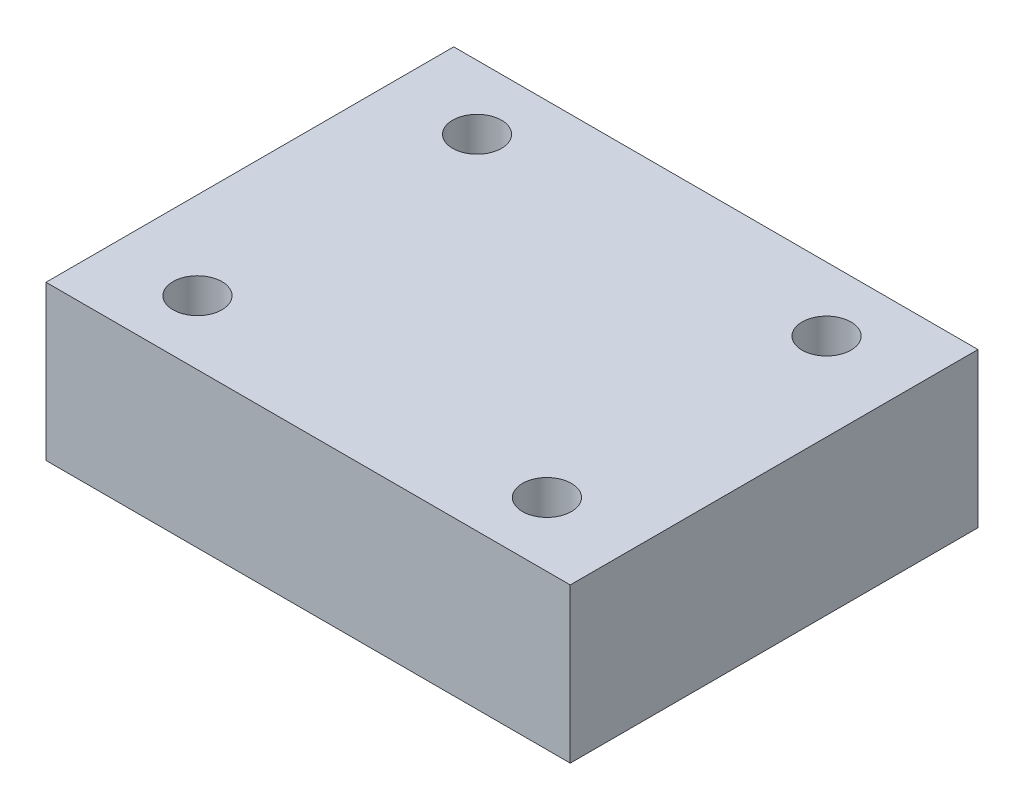
ISO-10303-21;
HEADER;
FILE_DESCRIPTION(('STEP AP214'),'2;1');
FILE_NAME('part.step','',(''),(''),'','','');
FILE_SCHEMA(('AUTOMOTIVE_DESIGN { 1 0 10303 214 1 1 1 1 }'));
ENDSEC;
DATA;
#1=APPLICATION_CONTEXT('core data for automotive mechanical design processes');
#2=APPLICATION_PROTOCOL_DEFINITION('international standard','automotive_design',2000,#1);
#3=PRODUCT_CONTEXT('',#1,'mechanical');
#4=PRODUCT('Part','Part','',(#3));
#5=PRODUCT_RELATED_PRODUCT_CATEGORY('part','',(#4));
#6=PRODUCT_DEFINITION_FORMATION('','',#4);
#7=PRODUCT_DEFINITION_CONTEXT('part definition',#1,'design');
#8=PRODUCT_DEFINITION('design','',#6,#7);
#9=PRODUCT_DEFINITION_SHAPE('','',#8);
#10=(LENGTH_UNIT() NAMED_UNIT(*) SI_UNIT(.MILLI.,.METRE.));
#11=(NAMED_UNIT(*) PLANE_ANGLE_UNIT() SI_UNIT($,.RADIAN.));
#12=(NAMED_UNIT(*) SI_UNIT($,.STERADIAN.) SOLID_ANGLE_UNIT());
#13=UNCERTAINTY_MEASURE_WITH_UNIT(LENGTH_MEASURE(1.E-05),#10,'distance_accuracy_value','');
#14=(GEOMETRIC_REPRESENTATION_CONTEXT(3) GLOBAL_UNCERTAINTY_ASSIGNED_CONTEXT((#13)) GLOBAL_UNIT_ASSIGNED_CONTEXT((#10,
#11,#12)) REPRESENTATION_CONTEXT('',''));
#15=CARTESIAN_POINT('',(0.,0.,0.));
#16=DIRECTION('',(0.,0.,1.));
#17=DIRECTION('',(1.,0.,0.));
#18=AXIS2_PLACEMENT_3D('',#15,#16,#17);
#19=CARTESIAN_POINT('',(0.,13.25,0.));
#20=DIRECTION('',(0.,-1.,0.));
#21=DIRECTION('',(0.,0.,-1.));
#22=AXIS2_PLACEMENT_3D('',#19,#20,#21);
#23=PLANE('',#22);
#24=DIRECTION('',(0.,0.,-1.));
#25=VECTOR('',#24,1.);
#26=CARTESIAN_POINT('',(22.5,13.25,17.5));
#27=LINE('',#26,#25);
#28=CARTESIAN_POINT('',(22.5,13.25,17.5));
#29=VERTEX_POINT('',#28);
#30=CARTESIAN_POINT('',(22.5,13.25,-17.5));
#31=VERTEX_POINT('',#30);
#32=EDGE_CURVE('E91',#29,#31,#27,.T.);
#33=ORIENTED_EDGE('',*,*,#32,.T.);
#34=DIRECTION('',(-1.,0.,0.));
#35=VECTOR('',#34,1.);
#36=CARTESIAN_POINT('',(-22.5,13.25,-17.5));
#37=LINE('',#36,#35);
#38=CARTESIAN_POINT('',(-22.5,13.25,-17.5));
#39=VERTEX_POINT('',#38);
#40=EDGE_CURVE('E86',#31,#39,#37,.T.);
#41=ORIENTED_EDGE('',*,*,#40,.T.);
#42=DIRECTION('',(0.,0.,1.));
#43=VECTOR('',#42,1.);
#44=CARTESIAN_POINT('',(-22.5,13.25,17.5));
#45=LINE('',#44,#43);
#46=CARTESIAN_POINT('',(-22.5,13.25,17.5));
#47=VERTEX_POINT('',#46);
#48=EDGE_CURVE('E89',#39,#47,#45,.T.);
#49=ORIENTED_EDGE('',*,*,#48,.T.);
#50=DIRECTION('',(1.,0.,0.));
#51=VECTOR('',#50,1.);
#52=CARTESIAN_POINT('',(-22.5,13.25,17.5));
#53=LINE('',#52,#51);
#54=EDGE_CURVE('E56',#47,#29,#53,.T.);
#55=ORIENTED_EDGE('',*,*,#54,.T.);
#56=EDGE_LOOP('',(#33,#41,#49,#55));
#57=FACE_BOUND('',#56,.T.);
#58=CARTESIAN_POINT('',(-15.,13.25,-12.));
#59=DIRECTION('',(0.,1.,0.));
#60=DIRECTION('',(0.,0.,1.));
#61=AXIS2_PLACEMENT_3D('',#58,#59,#60);
#62=CIRCLE('',#61,2.1);
#63=CARTESIAN_POINT('',(-15.,13.25,-9.9));
#64=VERTEX_POINT('',#63);
#65=EDGE_CURVE('E106',#64,#64,#62,.T.);
#66=ORIENTED_EDGE('',*,*,#65,.F.);
#67=EDGE_LOOP('',(#66));
#68=FACE_BOUND('',#67,.T.);
#69=CARTESIAN_POINT('',(15.,13.25,-12.));
#70=DIRECTION('',(0.,1.,0.));
#71=DIRECTION('',(0.,0.,1.));
#72=AXIS2_PLACEMENT_3D('',#69,#70,#71);
#73=CIRCLE('',#72,2.1);
#74=CARTESIAN_POINT('',(15.,13.25,-9.9));
#75=VERTEX_POINT('',#74);
#76=EDGE_CURVE('E121',#75,#75,#73,.T.);
#77=ORIENTED_EDGE('',*,*,#76,.F.);
#78=EDGE_LOOP('',(#77));
#79=FACE_BOUND('',#78,.T.);
#80=CARTESIAN_POINT('',(15.0000000000002,13.25,12.));
#81=DIRECTION('',(0.,1.,0.));
#82=DIRECTION('',(0.,0.,1.));
#83=AXIS2_PLACEMENT_3D('',#80,#81,#82);
#84=CIRCLE('',#83,2.1);
#85=CARTESIAN_POINT('',(15.0000000000002,13.25,14.1));
#86=VERTEX_POINT('',#85);
#87=EDGE_CURVE('E127',#86,#86,#84,.T.);
#88=ORIENTED_EDGE('',*,*,#87,.F.);
#89=EDGE_LOOP('',(#88));
#90=FACE_BOUND('',#89,.T.);
#91=CARTESIAN_POINT('',(-14.9999999999998,13.25,12.));
#92=DIRECTION('',(0.,1.,0.));
#93=DIRECTION('',(0.,0.,1.));
#94=AXIS2_PLACEMENT_3D('',#91,#92,#93);
#95=CIRCLE('',#94,2.1);
#96=CARTESIAN_POINT('',(-14.9999999999998,13.25,14.1));
#97=VERTEX_POINT('',#96);
#98=EDGE_CURVE('E133',#97,#97,#95,.T.);
#99=ORIENTED_EDGE('',*,*,#98,.F.);
#100=EDGE_LOOP('',(#99));
#101=FACE_BOUND('',#100,.T.);
#102=ADVANCED_FACE('F39',(#57,#68,#79,#90,#101),#23,.F.);
#103=CARTESIAN_POINT('',(0.,0.,0.));
#104=DIRECTION('',(0.,-1.,0.));
#105=DIRECTION('',(0.,0.,-1.));
#106=AXIS2_PLACEMENT_3D('',#103,#104,#105);
#107=PLANE('',#106);
#108=CARTESIAN_POINT('',(15.0000000000002,0.,12.));
#109=DIRECTION('',(0.,1.,0.));
#110=DIRECTION('',(0.,0.,1.));
#111=AXIS2_PLACEMENT_3D('',#108,#109,#110);
#112=CIRCLE('',#111,2.1);
#113=CARTESIAN_POINT('',(15.0000000000002,0.,14.1));
#114=VERTEX_POINT('',#113);
#115=EDGE_CURVE('E130',#114,#114,#112,.T.);
#116=ORIENTED_EDGE('',*,*,#115,.T.);
#117=EDGE_LOOP('',(#116));
#118=FACE_BOUND('',#117,.T.);
#119=CARTESIAN_POINT('',(-15.,0.,-12.));
#120=DIRECTION('',(0.,1.,0.));
#121=DIRECTION('',(0.,0.,1.));
#122=AXIS2_PLACEMENT_3D('',#119,#120,#121);
#123=CIRCLE('',#122,2.1);
#124=CARTESIAN_POINT('',(-15.,0.,-9.9));
#125=VERTEX_POINT('',#124);
#126=EDGE_CURVE('E118',#125,#125,#123,.T.);
#127=ORIENTED_EDGE('',*,*,#126,.T.);
#128=EDGE_LOOP('',(#127));
#129=FACE_BOUND('',#128,.T.);
#130=DIRECTION('',(0.,0.,-1.));
#131=VECTOR('',#130,1.);
#132=CARTESIAN_POINT('',(22.5,0.,17.5));
#133=LINE('',#132,#131);
#134=CARTESIAN_POINT('',(22.5,0.,17.5));
#135=VERTEX_POINT('',#134);
#136=CARTESIAN_POINT('',(22.5,0.,-17.5));
#137=VERTEX_POINT('',#136);
#138=EDGE_CURVE('E103',#135,#137,#133,.T.);
#139=ORIENTED_EDGE('',*,*,#138,.F.);
#140=DIRECTION('',(1.,0.,0.));
#141=VECTOR('',#140,1.);
#142=CARTESIAN_POINT('',(-22.5,0.,17.5));
#143=LINE('',#142,#141);
#144=CARTESIAN_POINT('',(-22.5,0.,17.5));
#145=VERTEX_POINT('',#144);
#146=EDGE_CURVE('E79',#145,#135,#143,.T.);
#147=ORIENTED_EDGE('',*,*,#146,.F.);
#148=DIRECTION('',(0.,0.,1.));
#149=VECTOR('',#148,1.);
#150=CARTESIAN_POINT('',(-22.5,0.,17.5));
#151=LINE('',#150,#149);
#152=CARTESIAN_POINT('',(-22.5,0.,-17.5));
#153=VERTEX_POINT('',#152);
#154=EDGE_CURVE('E73',#153,#145,#151,.T.);
#155=ORIENTED_EDGE('',*,*,#154,.F.);
#156=DIRECTION('',(-1.,0.,0.));
#157=VECTOR('',#156,1.);
#158=CARTESIAN_POINT('',(-22.5,0.,-17.5));
#159=LINE('',#158,#157);
#160=EDGE_CURVE('E95',#137,#153,#159,.T.);
#161=ORIENTED_EDGE('',*,*,#160,.F.);
#162=EDGE_LOOP('',(#139,#147,#155,#161));
#163=FACE_BOUND('',#162,.T.);
#164=CARTESIAN_POINT('',(15.,0.,-12.));
#165=DIRECTION('',(0.,1.,0.));
#166=DIRECTION('',(0.,0.,1.));
#167=AXIS2_PLACEMENT_3D('',#164,#165,#166);
#168=CIRCLE('',#167,2.1);
#169=CARTESIAN_POINT('',(15.,0.,-9.9));
#170=VERTEX_POINT('',#169);
#171=EDGE_CURVE('E124',#170,#170,#168,.T.);
#172=ORIENTED_EDGE('',*,*,#171,.T.);
#173=EDGE_LOOP('',(#172));
#174=FACE_BOUND('',#173,.T.);
#175=CARTESIAN_POINT('',(-14.9999999999998,0.,12.));
#176=DIRECTION('',(0.,1.,0.));
#177=DIRECTION('',(0.,0.,1.));
#178=AXIS2_PLACEMENT_3D('',#175,#176,#177);
#179=CIRCLE('',#178,2.1);
#180=CARTESIAN_POINT('',(-14.9999999999998,0.,14.1));
#181=VERTEX_POINT('',#180);
#182=EDGE_CURVE('E136',#181,#181,#179,.T.);
#183=ORIENTED_EDGE('',*,*,#182,.T.);
#184=EDGE_LOOP('',(#183));
#185=FACE_BOUND('',#184,.T.);
#186=ADVANCED_FACE('F114',(#118,#129,#163,#174,#185),#107,.T.);
#187=CARTESIAN_POINT('',(22.5,13.25,17.5));
#188=DIRECTION('',(-1.,0.,0.));
#189=DIRECTION('',(0.,0.,1.));
#190=AXIS2_PLACEMENT_3D('',#187,#188,#189);
#191=PLANE('',#190);
#192=ORIENTED_EDGE('',*,*,#138,.T.);
#193=DIRECTION('',(0.,-1.,0.));
#194=VECTOR('',#193,1.);
#195=CARTESIAN_POINT('',(22.5,13.25,-17.5));
#196=LINE('',#195,#194);
#197=EDGE_CURVE('E11',#31,#137,#196,.T.);
#198=ORIENTED_EDGE('',*,*,#197,.F.);
#199=ORIENTED_EDGE('',*,*,#32,.F.);
#200=DIRECTION('',(0.,-1.,0.));
#201=VECTOR('',#200,1.);
#202=CARTESIAN_POINT('',(22.5,13.25,17.5));
#203=LINE('',#202,#201);
#204=EDGE_CURVE('E99',#29,#135,#203,.T.);
#205=ORIENTED_EDGE('',*,*,#204,.T.);
#206=EDGE_LOOP('',(#192,#198,#199,#205));
#207=FACE_BOUND('',#206,.T.);
#208=ADVANCED_FACE('F41',(#207),#191,.F.);
#209=CARTESIAN_POINT('',(-22.5,13.25,-17.5));
#210=DIRECTION('',(0.,0.,1.));
#211=DIRECTION('',(1.,0.,0.));
#212=AXIS2_PLACEMENT_3D('',#209,#210,#211);
#213=PLANE('',#212);
#214=ORIENTED_EDGE('',*,*,#160,.T.);
#215=DIRECTION('',(0.,-1.,0.));
#216=VECTOR('',#215,1.);
#217=CARTESIAN_POINT('',(-22.5,13.25,-17.5));
#218=LINE('',#217,#216);
#219=EDGE_CURVE('E48',#39,#153,#218,.T.);
#220=ORIENTED_EDGE('',*,*,#219,.F.);
#221=ORIENTED_EDGE('',*,*,#40,.F.);
#222=ORIENTED_EDGE('',*,*,#197,.T.);
#223=EDGE_LOOP('',(#214,#220,#221,#222));
#224=FACE_BOUND('',#223,.T.);
#225=ADVANCED_FACE('F94',(#224),#213,.F.);
#226=CARTESIAN_POINT('',(-22.5,13.25,17.5));
#227=DIRECTION('',(1.,0.,0.));
#228=DIRECTION('',(0.,0.,-1.));
#229=AXIS2_PLACEMENT_3D('',#226,#227,#228);
#230=PLANE('',#229);
#231=ORIENTED_EDGE('',*,*,#154,.T.);
#232=DIRECTION('',(0.,-1.,0.));
#233=VECTOR('',#232,1.);
#234=CARTESIAN_POINT('',(-22.5,13.25,17.5));
#235=LINE('',#234,#233);
#236=EDGE_CURVE('E96',#47,#145,#235,.T.);
#237=ORIENTED_EDGE('',*,*,#236,.F.);
#238=ORIENTED_EDGE('',*,*,#48,.F.);
#239=ORIENTED_EDGE('',*,*,#219,.T.);
#240=EDGE_LOOP('',(#231,#237,#238,#239));
#241=FACE_BOUND('',#240,.T.);
#242=ADVANCED_FACE('F97',(#241),#230,.F.);
#243=CARTESIAN_POINT('',(-22.5,13.25,17.5));
#244=DIRECTION('',(0.,0.,-1.));
#245=DIRECTION('',(-1.,0.,0.));
#246=AXIS2_PLACEMENT_3D('',#243,#244,#245);
#247=PLANE('',#246);
#248=ORIENTED_EDGE('',*,*,#146,.T.);
#249=ORIENTED_EDGE('',*,*,#204,.F.);
#250=ORIENTED_EDGE('',*,*,#54,.F.);
#251=ORIENTED_EDGE('',*,*,#236,.T.);
#252=EDGE_LOOP('',(#248,#249,#250,#251));
#253=FACE_BOUND('',#252,.T.);
#254=ADVANCED_FACE('F111',(#253),#247,.F.);
#255=CARTESIAN_POINT('',(-15.,13.25,-12.));
#256=DIRECTION('',(0.,-1.,0.));
#257=DIRECTION('',(0.,0.,-1.));
#258=AXIS2_PLACEMENT_3D('',#255,#256,#257);
#259=CYLINDRICAL_SURFACE('',#258,2.1);
#260=ORIENTED_EDGE('',*,*,#65,.T.);
#261=EDGE_LOOP('',(#260));
#262=FACE_BOUND('',#261,.T.);
#263=ORIENTED_EDGE('',*,*,#126,.F.);
#264=EDGE_LOOP('',(#263));
#265=FACE_BOUND('',#264,.T.);
#266=ADVANCED_FACE('F153',(#262,#265),#259,.F.);
#267=CARTESIAN_POINT('',(15.,13.25,-12.));
#268=DIRECTION('',(0.,-1.,0.));
#269=DIRECTION('',(0.,0.,-1.));
#270=AXIS2_PLACEMENT_3D('',#267,#268,#269);
#271=CYLINDRICAL_SURFACE('',#270,2.1);
#272=ORIENTED_EDGE('',*,*,#76,.T.);
#273=EDGE_LOOP('',(#272));
#274=FACE_BOUND('',#273,.T.);
#275=ORIENTED_EDGE('',*,*,#171,.F.);
#276=EDGE_LOOP('',(#275));
#277=FACE_BOUND('',#276,.T.);
#278=ADVANCED_FACE('F207',(#274,#277),#271,.F.);
#279=CARTESIAN_POINT('',(15.0000000000002,13.25,12.));
#280=DIRECTION('',(0.,-1.,0.));
#281=DIRECTION('',(0.,0.,-1.));
#282=AXIS2_PLACEMENT_3D('',#279,#280,#281);
#283=CYLINDRICAL_SURFACE('',#282,2.1);
#284=ORIENTED_EDGE('',*,*,#87,.T.);
#285=EDGE_LOOP('',(#284));
#286=FACE_BOUND('',#285,.T.);
#287=ORIENTED_EDGE('',*,*,#115,.F.);
#288=EDGE_LOOP('',(#287));
#289=FACE_BOUND('',#288,.T.);
#290=ADVANCED_FACE('F216',(#286,#289),#283,.F.);
#291=CARTESIAN_POINT('',(-14.9999999999998,13.25,12.));
#292=DIRECTION('',(0.,-1.,0.));
#293=DIRECTION('',(0.,0.,-1.));
#294=AXIS2_PLACEMENT_3D('',#291,#292,#293);
#295=CYLINDRICAL_SURFACE('',#294,2.1);
#296=ORIENTED_EDGE('',*,*,#98,.T.);
#297=EDGE_LOOP('',(#296));
#298=FACE_BOUND('',#297,.T.);
#299=ORIENTED_EDGE('',*,*,#182,.F.);
#300=EDGE_LOOP('',(#299));
#301=FACE_BOUND('',#300,.T.);
#302=ADVANCED_FACE('F142',(#298,#301),#295,.F.);
#303=CLOSED_SHELL('',(#102,#186,#208,#225,#242,#254,#266,#278,#290,#302));
#304=MANIFOLD_SOLID_BREP('B2',#303);
#305=ADVANCED_BREP_SHAPE_REPRESENTATION('',(#18,#304),#14);
#306=SHAPE_DEFINITION_REPRESENTATION(#9,#305);
ENDSEC;
END-ISO-10303-21;
